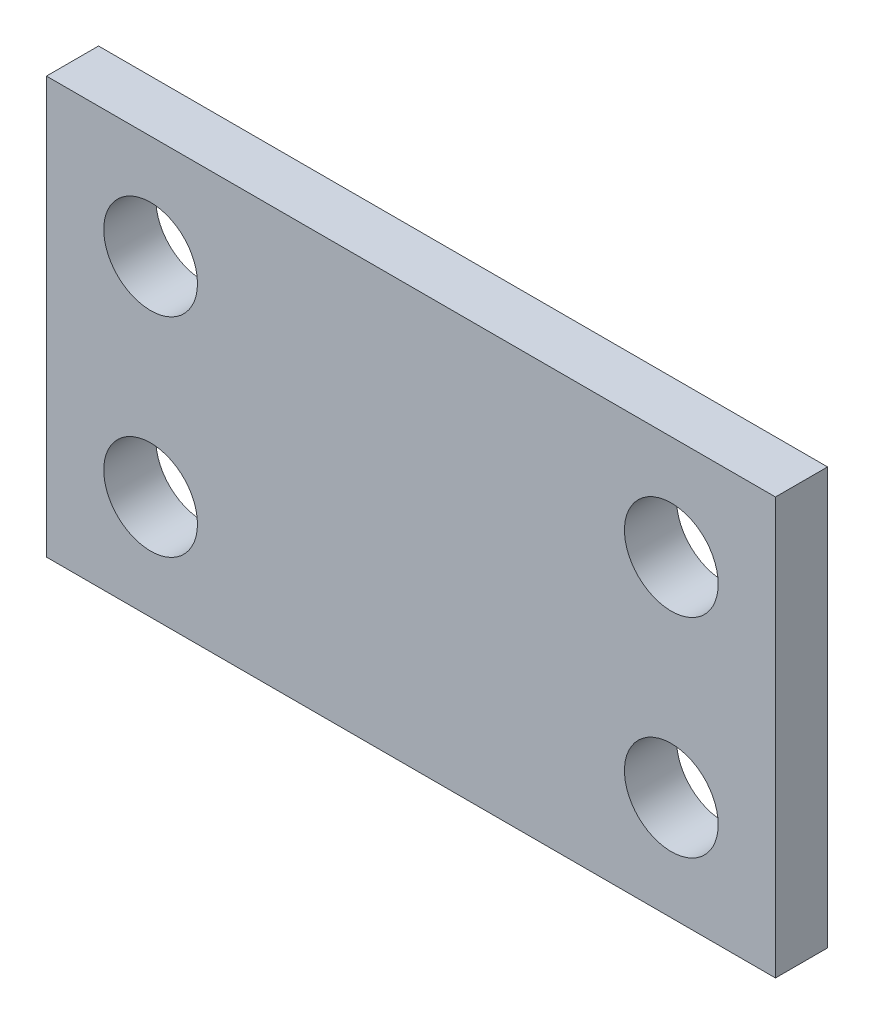
ISO-10303-21;
HEADER;
FILE_DESCRIPTION(('STEP AP214'),'2;1');
FILE_NAME('part.step','',(''),(''),'','','');
FILE_SCHEMA(('AUTOMOTIVE_DESIGN { 1 0 10303 214 1 1 1 1 }'));
ENDSEC;
DATA;
#1=APPLICATION_CONTEXT('core data for automotive mechanical design processes');
#2=APPLICATION_PROTOCOL_DEFINITION('international standard','automotive_design',2000,#1);
#3=PRODUCT_CONTEXT('',#1,'mechanical');
#4=PRODUCT('Part','Part','',(#3));
#5=PRODUCT_RELATED_PRODUCT_CATEGORY('part','',(#4));
#6=PRODUCT_DEFINITION_FORMATION('','',#4);
#7=PRODUCT_DEFINITION_CONTEXT('part definition',#1,'design');
#8=PRODUCT_DEFINITION('design','',#6,#7);
#9=PRODUCT_DEFINITION_SHAPE('','',#8);
#10=(LENGTH_UNIT() NAMED_UNIT(*) SI_UNIT(.MILLI.,.METRE.));
#11=(NAMED_UNIT(*) PLANE_ANGLE_UNIT() SI_UNIT($,.RADIAN.));
#12=(NAMED_UNIT(*) SI_UNIT($,.STERADIAN.) SOLID_ANGLE_UNIT());
#13=UNCERTAINTY_MEASURE_WITH_UNIT(LENGTH_MEASURE(1.E-05),#10,'distance_accuracy_value','');
#14=(GEOMETRIC_REPRESENTATION_CONTEXT(3) GLOBAL_UNCERTAINTY_ASSIGNED_CONTEXT((#13)) GLOBAL_UNIT_ASSIGNED_CONTEXT((#10,
#11,#12)) REPRESENTATION_CONTEXT('',''));
#15=CARTESIAN_POINT('',(0.,0.,0.));
#16=DIRECTION('',(0.,0.,1.));
#17=DIRECTION('',(1.,0.,0.));
#18=AXIS2_PLACEMENT_3D('',#15,#16,#17);
#19=CARTESIAN_POINT('',(0.,0.,10.));
#20=DIRECTION('',(0.,0.,1.));
#21=DIRECTION('',(1.,0.,0.));
#22=AXIS2_PLACEMENT_3D('',#19,#20,#21);
#23=PLANE('',#22);
#24=CARTESIAN_POINT('',(-50.,-20.,10.));
#25=DIRECTION('',(0.,0.,1.));
#26=DIRECTION('',(1.,0.,0.));
#27=AXIS2_PLACEMENT_3D('',#24,#25,#26);
#28=CIRCLE('',#27,9.);
#29=CARTESIAN_POINT('',(-41.,-20.,10.));
#30=VERTEX_POINT('',#29);
#31=EDGE_CURVE('E142',#30,#30,#28,.T.);
#32=ORIENTED_EDGE('',*,*,#31,.F.);
#33=EDGE_LOOP('',(#32));
#34=FACE_BOUND('',#33,.T.);
#35=CARTESIAN_POINT('',(50.,20.,10.));
#36=DIRECTION('',(0.,0.,1.));
#37=DIRECTION('',(1.,0.,0.));
#38=AXIS2_PLACEMENT_3D('',#35,#36,#37);
#39=CIRCLE('',#38,9.);
#40=CARTESIAN_POINT('',(59.,20.,10.));
#41=VERTEX_POINT('',#40);
#42=EDGE_CURVE('E112',#41,#41,#39,.T.);
#43=ORIENTED_EDGE('',*,*,#42,.F.);
#44=EDGE_LOOP('',(#43));
#45=FACE_BOUND('',#44,.T.);
#46=DIRECTION('',(0.,1.,0.));
#47=VECTOR('',#46,1.);
#48=CARTESIAN_POINT('',(70.,40.,10.));
#49=LINE('',#48,#47);
#50=CARTESIAN_POINT('',(70.,-40.,10.));
#51=VERTEX_POINT('',#50);
#52=CARTESIAN_POINT('',(70.,40.,10.));
#53=VERTEX_POINT('',#52);
#54=EDGE_CURVE('E92',#51,#53,#49,.T.);
#55=ORIENTED_EDGE('',*,*,#54,.T.);
#56=DIRECTION('',(-1.,0.,0.));
#57=VECTOR('',#56,1.);
#58=CARTESIAN_POINT('',(-70.,40.,10.));
#59=LINE('',#58,#57);
#60=CARTESIAN_POINT('',(-70.,40.,10.));
#61=VERTEX_POINT('',#60);
#62=EDGE_CURVE('E87',#53,#61,#59,.T.);
#63=ORIENTED_EDGE('',*,*,#62,.T.);
#64=DIRECTION('',(0.,-1.,0.));
#65=VECTOR('',#64,1.);
#66=CARTESIAN_POINT('',(-70.,40.,10.));
#67=LINE('',#66,#65);
#68=CARTESIAN_POINT('',(-70.,-40.,10.));
#69=VERTEX_POINT('',#68);
#70=EDGE_CURVE('E90',#61,#69,#67,.T.);
#71=ORIENTED_EDGE('',*,*,#70,.T.);
#72=DIRECTION('',(1.,0.,0.));
#73=VECTOR('',#72,1.);
#74=CARTESIAN_POINT('',(-70.,-40.,10.));
#75=LINE('',#74,#73);
#76=EDGE_CURVE('E57',#69,#51,#75,.T.);
#77=ORIENTED_EDGE('',*,*,#76,.T.);
#78=EDGE_LOOP('',(#55,#63,#71,#77));
#79=FACE_BOUND('',#78,.T.);
#80=CARTESIAN_POINT('',(-50.,20.,10.));
#81=DIRECTION('',(0.,0.,1.));
#82=DIRECTION('',(1.,0.,0.));
#83=AXIS2_PLACEMENT_3D('',#80,#81,#82);
#84=CIRCLE('',#83,9.);
#85=CARTESIAN_POINT('',(-41.,20.,10.));
#86=VERTEX_POINT('',#85);
#87=EDGE_CURVE('E134',#86,#86,#84,.T.);
#88=ORIENTED_EDGE('',*,*,#87,.F.);
#89=EDGE_LOOP('',(#88));
#90=FACE_BOUND('',#89,.T.);
#91=CARTESIAN_POINT('',(50.,-20.,10.));
#92=DIRECTION('',(0.,0.,1.));
#93=DIRECTION('',(1.,0.,0.));
#94=AXIS2_PLACEMENT_3D('',#91,#92,#93);
#95=CIRCLE('',#94,9.);
#96=CARTESIAN_POINT('',(59.,-20.,10.));
#97=VERTEX_POINT('',#96);
#98=EDGE_CURVE('E150',#97,#97,#95,.T.);
#99=ORIENTED_EDGE('',*,*,#98,.F.);
#100=EDGE_LOOP('',(#99));
#101=FACE_BOUND('',#100,.T.);
#102=ADVANCED_FACE('F39',(#34,#45,#79,#90,#101),#23,.T.);
#103=CARTESIAN_POINT('',(0.,0.,0.));
#104=DIRECTION('',(0.,0.,1.));
#105=DIRECTION('',(1.,0.,0.));
#106=AXIS2_PLACEMENT_3D('',#103,#104,#105);
#107=PLANE('',#106);
#108=DIRECTION('',(0.,1.,0.));
#109=VECTOR('',#108,1.);
#110=CARTESIAN_POINT('',(70.,40.,0.));
#111=LINE('',#110,#109);
#112=CARTESIAN_POINT('',(70.,-40.,0.));
#113=VERTEX_POINT('',#112);
#114=CARTESIAN_POINT('',(70.,40.,0.));
#115=VERTEX_POINT('',#114);
#116=EDGE_CURVE('E108',#113,#115,#111,.T.);
#117=ORIENTED_EDGE('',*,*,#116,.F.);
#118=DIRECTION('',(1.,0.,0.));
#119=VECTOR('',#118,1.);
#120=CARTESIAN_POINT('',(-70.,-40.,0.));
#121=LINE('',#120,#119);
#122=CARTESIAN_POINT('',(-70.,-40.,0.));
#123=VERTEX_POINT('',#122);
#124=EDGE_CURVE('E80',#123,#113,#121,.T.);
#125=ORIENTED_EDGE('',*,*,#124,.F.);
#126=DIRECTION('',(0.,-1.,0.));
#127=VECTOR('',#126,1.);
#128=CARTESIAN_POINT('',(-70.,40.,0.));
#129=LINE('',#128,#127);
#130=CARTESIAN_POINT('',(-70.,40.,0.));
#131=VERTEX_POINT('',#130);
#132=EDGE_CURVE('E74',#131,#123,#129,.T.);
#133=ORIENTED_EDGE('',*,*,#132,.F.);
#134=DIRECTION('',(-1.,0.,0.));
#135=VECTOR('',#134,1.);
#136=CARTESIAN_POINT('',(-70.,40.,0.));
#137=LINE('',#136,#135);
#138=EDGE_CURVE('E97',#115,#131,#137,.T.);
#139=ORIENTED_EDGE('',*,*,#138,.F.);
#140=EDGE_LOOP('',(#117,#125,#133,#139));
#141=FACE_BOUND('',#140,.T.);
#142=CARTESIAN_POINT('',(50.,20.,0.));
#143=DIRECTION('',(0.,0.,1.));
#144=DIRECTION('',(1.,0.,0.));
#145=AXIS2_PLACEMENT_3D('',#142,#143,#144);
#146=CIRCLE('',#145,9.);
#147=CARTESIAN_POINT('',(59.,20.,0.));
#148=VERTEX_POINT('',#147);
#149=EDGE_CURVE('E130',#148,#148,#146,.T.);
#150=ORIENTED_EDGE('',*,*,#149,.T.);
#151=EDGE_LOOP('',(#150));
#152=FACE_BOUND('',#151,.T.);
#153=CARTESIAN_POINT('',(-50.,20.,0.));
#154=DIRECTION('',(0.,0.,1.));
#155=DIRECTION('',(1.,0.,0.));
#156=AXIS2_PLACEMENT_3D('',#153,#154,#155);
#157=CIRCLE('',#156,9.);
#158=CARTESIAN_POINT('',(-41.,20.,0.));
#159=VERTEX_POINT('',#158);
#160=EDGE_CURVE('E138',#159,#159,#157,.T.);
#161=ORIENTED_EDGE('',*,*,#160,.T.);
#162=EDGE_LOOP('',(#161));
#163=FACE_BOUND('',#162,.T.);
#164=CARTESIAN_POINT('',(-50.,-20.,0.));
#165=DIRECTION('',(0.,0.,1.));
#166=DIRECTION('',(1.,0.,0.));
#167=AXIS2_PLACEMENT_3D('',#164,#165,#166);
#168=CIRCLE('',#167,9.);
#169=CARTESIAN_POINT('',(-41.,-20.,0.));
#170=VERTEX_POINT('',#169);
#171=EDGE_CURVE('E146',#170,#170,#168,.T.);
#172=ORIENTED_EDGE('',*,*,#171,.T.);
#173=EDGE_LOOP('',(#172));
#174=FACE_BOUND('',#173,.T.);
#175=CARTESIAN_POINT('',(50.,-20.,0.));
#176=DIRECTION('',(0.,0.,1.));
#177=DIRECTION('',(1.,0.,0.));
#178=AXIS2_PLACEMENT_3D('',#175,#176,#177);
#179=CIRCLE('',#178,9.);
#180=CARTESIAN_POINT('',(59.,-20.,0.));
#181=VERTEX_POINT('',#180);
#182=EDGE_CURVE('E154',#181,#181,#179,.T.);
#183=ORIENTED_EDGE('',*,*,#182,.T.);
#184=EDGE_LOOP('',(#183));
#185=FACE_BOUND('',#184,.T.);
#186=ADVANCED_FACE('F125',(#141,#152,#163,#174,#185),#107,.F.);
#187=CARTESIAN_POINT('',(70.,40.,10.));
#188=DIRECTION('',(-1.,0.,0.));
#189=DIRECTION('',(0.,0.,1.));
#190=AXIS2_PLACEMENT_3D('',#187,#188,#189);
#191=PLANE('',#190);
#192=ORIENTED_EDGE('',*,*,#116,.T.);
#193=DIRECTION('',(0.,0.,-1.));
#194=VECTOR('',#193,1.);
#195=CARTESIAN_POINT('',(70.,40.,10.));
#196=LINE('',#195,#194);
#197=EDGE_CURVE('E11',#53,#115,#196,.T.);
#198=ORIENTED_EDGE('',*,*,#197,.F.);
#199=ORIENTED_EDGE('',*,*,#54,.F.);
#200=DIRECTION('',(0.,0.,-1.));
#201=VECTOR('',#200,1.);
#202=CARTESIAN_POINT('',(70.,-40.,10.));
#203=LINE('',#202,#201);
#204=EDGE_CURVE('E104',#51,#113,#203,.T.);
#205=ORIENTED_EDGE('',*,*,#204,.T.);
#206=EDGE_LOOP('',(#192,#198,#199,#205));
#207=FACE_BOUND('',#206,.T.);
#208=ADVANCED_FACE('F41',(#207),#191,.F.);
#209=CARTESIAN_POINT('',(-70.,40.,10.));
#210=DIRECTION('',(0.,-1.,0.));
#211=DIRECTION('',(0.,0.,-1.));
#212=AXIS2_PLACEMENT_3D('',#209,#210,#211);
#213=PLANE('',#212);
#214=ORIENTED_EDGE('',*,*,#138,.T.);
#215=DIRECTION('',(0.,0.,-1.));
#216=VECTOR('',#215,1.);
#217=CARTESIAN_POINT('',(-70.,40.,10.));
#218=LINE('',#217,#216);
#219=EDGE_CURVE('E49',#61,#131,#218,.T.);
#220=ORIENTED_EDGE('',*,*,#219,.F.);
#221=ORIENTED_EDGE('',*,*,#62,.F.);
#222=ORIENTED_EDGE('',*,*,#197,.T.);
#223=EDGE_LOOP('',(#214,#220,#221,#222));
#224=FACE_BOUND('',#223,.T.);
#225=ADVANCED_FACE('F96',(#224),#213,.F.);
#226=CARTESIAN_POINT('',(-70.,40.,10.));
#227=DIRECTION('',(1.,0.,0.));
#228=DIRECTION('',(0.,0.,-1.));
#229=AXIS2_PLACEMENT_3D('',#226,#227,#228);
#230=PLANE('',#229);
#231=ORIENTED_EDGE('',*,*,#132,.T.);
#232=DIRECTION('',(0.,0.,-1.));
#233=VECTOR('',#232,1.);
#234=CARTESIAN_POINT('',(-70.,-40.,10.));
#235=LINE('',#234,#233);
#236=EDGE_CURVE('E99',#69,#123,#235,.T.);
#237=ORIENTED_EDGE('',*,*,#236,.F.);
#238=ORIENTED_EDGE('',*,*,#70,.F.);
#239=ORIENTED_EDGE('',*,*,#219,.T.);
#240=EDGE_LOOP('',(#231,#237,#238,#239));
#241=FACE_BOUND('',#240,.T.);
#242=ADVANCED_FACE('F100',(#241),#230,.F.);
#243=CARTESIAN_POINT('',(-70.,-40.,10.));
#244=DIRECTION('',(0.,1.,0.));
#245=DIRECTION('',(0.,0.,1.));
#246=AXIS2_PLACEMENT_3D('',#243,#244,#245);
#247=PLANE('',#246);
#248=ORIENTED_EDGE('',*,*,#124,.T.);
#249=ORIENTED_EDGE('',*,*,#204,.F.);
#250=ORIENTED_EDGE('',*,*,#76,.F.);
#251=ORIENTED_EDGE('',*,*,#236,.T.);
#252=EDGE_LOOP('',(#248,#249,#250,#251));
#253=FACE_BOUND('',#252,.T.);
#254=ADVANCED_FACE('F122',(#253),#247,.F.);
#255=CARTESIAN_POINT('',(50.,20.,10.));
#256=DIRECTION('',(0.,0.,-1.));
#257=DIRECTION('',(-1.,0.,0.));
#258=AXIS2_PLACEMENT_3D('',#255,#256,#257);
#259=CYLINDRICAL_SURFACE('',#258,9.);
#260=ORIENTED_EDGE('',*,*,#42,.T.);
#261=EDGE_LOOP('',(#260));
#262=FACE_BOUND('',#261,.T.);
#263=ORIENTED_EDGE('',*,*,#149,.F.);
#264=EDGE_LOOP('',(#263));
#265=FACE_BOUND('',#264,.T.);
#266=ADVANCED_FACE('F175',(#262,#265),#259,.F.);
#267=CARTESIAN_POINT('',(-50.,20.,10.));
#268=DIRECTION('',(0.,0.,-1.));
#269=DIRECTION('',(-1.,0.,0.));
#270=AXIS2_PLACEMENT_3D('',#267,#268,#269);
#271=CYLINDRICAL_SURFACE('',#270,9.);
#272=ORIENTED_EDGE('',*,*,#87,.T.);
#273=EDGE_LOOP('',(#272));
#274=FACE_BOUND('',#273,.T.);
#275=ORIENTED_EDGE('',*,*,#160,.F.);
#276=EDGE_LOOP('',(#275));
#277=FACE_BOUND('',#276,.T.);
#278=ADVANCED_FACE('F221',(#274,#277),#271,.F.);
#279=CARTESIAN_POINT('',(-50.,-20.,10.));
#280=DIRECTION('',(0.,0.,-1.));
#281=DIRECTION('',(-1.,0.,0.));
#282=AXIS2_PLACEMENT_3D('',#279,#280,#281);
#283=CYLINDRICAL_SURFACE('',#282,9.);
#284=ORIENTED_EDGE('',*,*,#31,.T.);
#285=EDGE_LOOP('',(#284));
#286=FACE_BOUND('',#285,.T.);
#287=ORIENTED_EDGE('',*,*,#171,.F.);
#288=EDGE_LOOP('',(#287));
#289=FACE_BOUND('',#288,.T.);
#290=ADVANCED_FACE('F229',(#286,#289),#283,.F.);
#291=CARTESIAN_POINT('',(50.,-20.,10.));
#292=DIRECTION('',(0.,0.,-1.));
#293=DIRECTION('',(-1.,0.,0.));
#294=AXIS2_PLACEMENT_3D('',#291,#292,#293);
#295=CYLINDRICAL_SURFACE('',#294,9.);
#296=ORIENTED_EDGE('',*,*,#98,.T.);
#297=EDGE_LOOP('',(#296));
#298=FACE_BOUND('',#297,.T.);
#299=ORIENTED_EDGE('',*,*,#182,.F.);
#300=EDGE_LOOP('',(#299));
#301=FACE_BOUND('',#300,.T.);
#302=ADVANCED_FACE('F162',(#298,#301),#295,.F.);
#303=CLOSED_SHELL('',(#102,#186,#208,#225,#242,#254,#266,#278,#290,#302));
#304=MANIFOLD_SOLID_BREP('B2',#303);
#305=ADVANCED_BREP_SHAPE_REPRESENTATION('',(#18,#304),#14);
#306=SHAPE_DEFINITION_REPRESENTATION(#9,#305);
ENDSEC;
END-ISO-10303-21;
